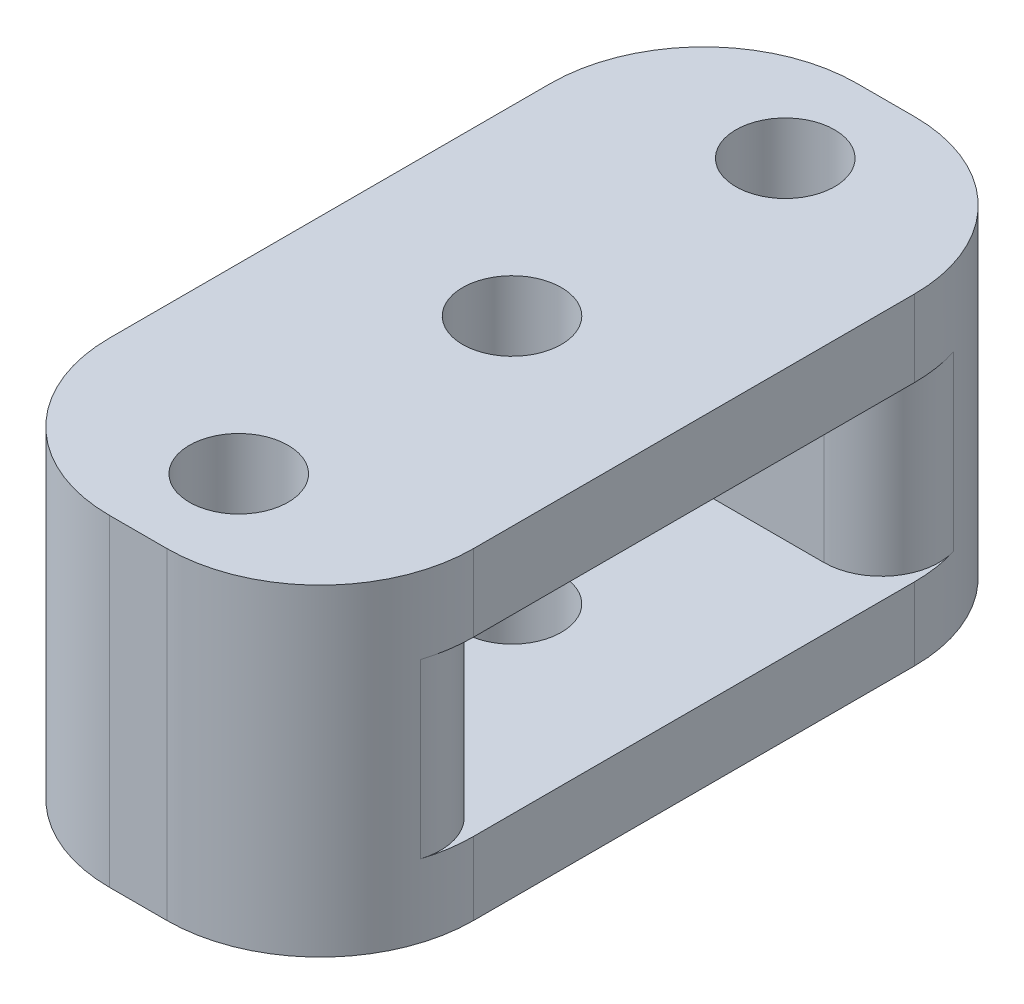
ISO-10303-21;
HEADER;
FILE_DESCRIPTION(('STEP AP214'),'2;1');
FILE_NAME('part.step','',(''),(''),'','','');
FILE_SCHEMA(('AUTOMOTIVE_DESIGN { 1 0 10303 214 1 1 1 1 }'));
ENDSEC;
DATA;
#1=APPLICATION_CONTEXT('core data for automotive mechanical design processes');
#2=APPLICATION_PROTOCOL_DEFINITION('international standard','automotive_design',2000,#1);
#3=PRODUCT_CONTEXT('',#1,'mechanical');
#4=PRODUCT('Part','Part','',(#3));
#5=PRODUCT_RELATED_PRODUCT_CATEGORY('part','',(#4));
#6=PRODUCT_DEFINITION_FORMATION('','',#4);
#7=PRODUCT_DEFINITION_CONTEXT('part definition',#1,'design');
#8=PRODUCT_DEFINITION('design','',#6,#7);
#9=PRODUCT_DEFINITION_SHAPE('','',#8);
#10=(LENGTH_UNIT() NAMED_UNIT(*) SI_UNIT(.MILLI.,.METRE.));
#11=(NAMED_UNIT(*) PLANE_ANGLE_UNIT() SI_UNIT($,.RADIAN.));
#12=(NAMED_UNIT(*) SI_UNIT($,.STERADIAN.) SOLID_ANGLE_UNIT());
#13=UNCERTAINTY_MEASURE_WITH_UNIT(LENGTH_MEASURE(1.E-05),#10,'distance_accuracy_value','');
#14=(GEOMETRIC_REPRESENTATION_CONTEXT(3) GLOBAL_UNCERTAINTY_ASSIGNED_CONTEXT((#13)) GLOBAL_UNIT_ASSIGNED_CONTEXT((#10,
#11,#12)) REPRESENTATION_CONTEXT('',''));
#15=CARTESIAN_POINT('',(0.,0.,0.));
#16=DIRECTION('',(0.,0.,1.));
#17=DIRECTION('',(1.,0.,0.));
#18=AXIS2_PLACEMENT_3D('',#15,#16,#17);
#19=CARTESIAN_POINT('',(-9.50000000000001,3.8,-19.5));
#20=DIRECTION('',(1.,0.,0.));
#21=DIRECTION('',(0.,0.,-1.));
#22=AXIS2_PLACEMENT_3D('',#19,#20,#21);
#23=PLANE('',#22);
#24=DIRECTION('',(0.,0.,1.));
#25=VECTOR('',#24,1.);
#26=CARTESIAN_POINT('',(-9.50000000000001,3.8,-19.5));
#27=LINE('',#26,#25);
#28=CARTESIAN_POINT('',(-9.50000000000001,3.8,-11.5));
#29=VERTEX_POINT('',#28);
#30=CARTESIAN_POINT('',(-9.5,3.8,11.5));
#31=VERTEX_POINT('',#30);
#32=EDGE_CURVE('E229',#29,#31,#27,.T.);
#33=ORIENTED_EDGE('',*,*,#32,.F.);
#34=DIRECTION('',(0.,-1.,0.));
#35=VECTOR('',#34,1.);
#36=CARTESIAN_POINT('',(-9.50000000000001,3.8,-11.5));
#37=LINE('',#36,#35);
#38=CARTESIAN_POINT('',(-9.50000000000001,0.,-11.5));
#39=VERTEX_POINT('',#38);
#40=EDGE_CURVE('E193',#29,#39,#37,.T.);
#41=ORIENTED_EDGE('',*,*,#40,.T.);
#42=DIRECTION('',(0.,0.,1.));
#43=VECTOR('',#42,1.);
#44=CARTESIAN_POINT('',(-9.50000000000001,0.,-19.5));
#45=LINE('',#44,#43);
#46=CARTESIAN_POINT('',(-9.5,0.,11.5));
#47=VERTEX_POINT('',#46);
#48=EDGE_CURVE('E218',#39,#47,#45,.T.);
#49=ORIENTED_EDGE('',*,*,#48,.T.);
#50=DIRECTION('',(0.,-1.,0.));
#51=VECTOR('',#50,1.);
#52=CARTESIAN_POINT('',(-9.5,3.8,11.5));
#53=LINE('',#52,#51);
#54=EDGE_CURVE('E186',#47,#31,#53,.F.);
#55=ORIENTED_EDGE('',*,*,#54,.T.);
#56=EDGE_LOOP('',(#33,#41,#49,#55));
#57=FACE_BOUND('',#56,.T.);
#58=ADVANCED_FACE('F42',(#57),#23,.F.);
#59=CARTESIAN_POINT('',(9.5,3.8,-19.5));
#60=DIRECTION('',(-1.,0.,0.));
#61=DIRECTION('',(0.,0.,1.));
#62=AXIS2_PLACEMENT_3D('',#59,#60,#61);
#63=PLANE('',#62);
#64=DIRECTION('',(0.,-1.,0.));
#65=VECTOR('',#64,1.);
#66=CARTESIAN_POINT('',(9.5,3.8,-11.5));
#67=LINE('',#66,#65);
#68=CARTESIAN_POINT('',(9.5,0.,-11.5));
#69=VERTEX_POINT('',#68);
#70=CARTESIAN_POINT('',(9.5,3.8,-11.5));
#71=VERTEX_POINT('',#70);
#72=EDGE_CURVE('E272',#69,#71,#67,.F.);
#73=ORIENTED_EDGE('',*,*,#72,.T.);
#74=DIRECTION('',(0.,0.,-1.));
#75=VECTOR('',#74,1.);
#76=CARTESIAN_POINT('',(9.5,3.8,-19.5));
#77=LINE('',#76,#75);
#78=CARTESIAN_POINT('',(9.5,3.8,11.5));
#79=VERTEX_POINT('',#78);
#80=EDGE_CURVE('E58',#79,#71,#77,.T.);
#81=ORIENTED_EDGE('',*,*,#80,.F.);
#82=DIRECTION('',(0.,-1.,0.));
#83=VECTOR('',#82,1.);
#84=CARTESIAN_POINT('',(9.5,3.8,11.5));
#85=LINE('',#84,#83);
#86=CARTESIAN_POINT('',(9.5,0.,11.5));
#87=VERTEX_POINT('',#86);
#88=EDGE_CURVE('E262',#79,#87,#85,.T.);
#89=ORIENTED_EDGE('',*,*,#88,.T.);
#90=DIRECTION('',(0.,0.,-1.));
#91=VECTOR('',#90,1.);
#92=CARTESIAN_POINT('',(9.5,0.,-19.5));
#93=LINE('',#92,#91);
#94=EDGE_CURVE('E213',#87,#69,#93,.T.);
#95=ORIENTED_EDGE('',*,*,#94,.T.);
#96=EDGE_LOOP('',(#73,#81,#89,#95));
#97=FACE_BOUND('',#96,.T.);
#98=ADVANCED_FACE('F408',(#97),#63,.F.);
#99=CARTESIAN_POINT('',(0.,3.8,0.));
#100=DIRECTION('',(0.,-1.,0.));
#101=DIRECTION('',(0.,0.,-1.));
#102=AXIS2_PLACEMENT_3D('',#99,#100,#101);
#103=PLANE('',#102);
#104=CARTESIAN_POINT('',(0.,3.8,0.));
#105=DIRECTION('',(0.,1.,0.));
#106=DIRECTION('',(0.,0.,1.));
#107=AXIS2_PLACEMENT_3D('',#104,#105,#106);
#108=CIRCLE('',#107,2.575);
#109=CARTESIAN_POINT('',(0.,3.8,-2.575));
#110=VERTEX_POINT('',#109);
#111=EDGE_CURVE('E225',#110,#110,#108,.T.);
#112=ORIENTED_EDGE('',*,*,#111,.F.);
#113=EDGE_LOOP('',(#112));
#114=FACE_BOUND('',#113,.T.);
#115=DIRECTION('',(-1.,0.,0.));
#116=VECTOR('',#115,1.);
#117=CARTESIAN_POINT('',(9.5,3.8,10.));
#118=LINE('',#117,#116);
#119=CARTESIAN_POINT('',(6.26969600708472,3.8,10.));
#120=VERTEX_POINT('',#119);
#121=CARTESIAN_POINT('',(-6.26969600708472,3.8,10.));
#122=VERTEX_POINT('',#121);
#123=EDGE_CURVE('E357',#120,#122,#118,.T.);
#124=ORIENTED_EDGE('',*,*,#123,.F.);
#125=CARTESIAN_POINT('',(6.26969600708472,3.8,13.));
#126=DIRECTION('',(0.,-1.,0.));
#127=DIRECTION('',(0.,0.,-1.));
#128=AXIS2_PLACEMENT_3D('',#125,#126,#127);
#129=CIRCLE('',#128,3.);
#130=CARTESIAN_POINT('',(9.13151361133556,3.8,13.9));
#131=VERTEX_POINT('',#130);
#132=EDGE_CURVE('E52',#120,#131,#129,.T.);
#133=ORIENTED_EDGE('',*,*,#132,.T.);
#134=CARTESIAN_POINT('',(1.5,3.8,11.5));
#135=DIRECTION('',(0.,-1.,0.));
#136=DIRECTION('',(0.,0.,-1.));
#137=AXIS2_PLACEMENT_3D('',#134,#135,#136);
#138=CIRCLE('',#137,8.);
#139=EDGE_CURVE('E327',#79,#131,#138,.T.);
#140=ORIENTED_EDGE('',*,*,#139,.F.);
#141=ORIENTED_EDGE('',*,*,#80,.T.);
#142=CARTESIAN_POINT('',(1.5,3.8,-11.5));
#143=DIRECTION('',(0.,-1.,0.));
#144=DIRECTION('',(0.,0.,-1.));
#145=AXIS2_PLACEMENT_3D('',#142,#143,#144);
#146=CIRCLE('',#145,8.);
#147=CARTESIAN_POINT('',(9.13151361133558,3.8,-13.9));
#148=VERTEX_POINT('',#147);
#149=EDGE_CURVE('E285',#148,#71,#146,.T.);
#150=ORIENTED_EDGE('',*,*,#149,.F.);
#151=CARTESIAN_POINT('',(6.26969600708474,3.8,-13.));
#152=DIRECTION('',(0.,-1.,0.));
#153=DIRECTION('',(0.,0.,-1.));
#154=AXIS2_PLACEMENT_3D('',#151,#152,#153);
#155=CIRCLE('',#154,3.);
#156=CARTESIAN_POINT('',(6.26969600708474,3.8,-10.));
#157=VERTEX_POINT('',#156);
#158=EDGE_CURVE('E333',#148,#157,#155,.T.);
#159=ORIENTED_EDGE('',*,*,#158,.T.);
#160=DIRECTION('',(1.,0.,0.));
#161=VECTOR('',#160,1.);
#162=CARTESIAN_POINT('',(9.5,3.8,-10.));
#163=LINE('',#162,#161);
#164=CARTESIAN_POINT('',(-6.26969600708474,3.8,-10.));
#165=VERTEX_POINT('',#164);
#166=EDGE_CURVE('E382',#165,#157,#163,.T.);
#167=ORIENTED_EDGE('',*,*,#166,.F.);
#168=CARTESIAN_POINT('',(-6.26969600708474,3.8,-13.));
#169=DIRECTION('',(0.,-1.,0.));
#170=DIRECTION('',(0.,0.,-1.));
#171=AXIS2_PLACEMENT_3D('',#168,#169,#170);
#172=CIRCLE('',#171,3.);
#173=CARTESIAN_POINT('',(-9.13151361133558,3.8,-13.9));
#174=VERTEX_POINT('',#173);
#175=EDGE_CURVE('E338',#165,#174,#172,.T.);
#176=ORIENTED_EDGE('',*,*,#175,.T.);
#177=CARTESIAN_POINT('',(-1.50000000000001,3.8,-11.5));
#178=DIRECTION('',(0.,-1.,0.));
#179=DIRECTION('',(0.,0.,-1.));
#180=AXIS2_PLACEMENT_3D('',#177,#178,#179);
#181=CIRCLE('',#180,8.);
#182=EDGE_CURVE('E301',#29,#174,#181,.T.);
#183=ORIENTED_EDGE('',*,*,#182,.F.);
#184=ORIENTED_EDGE('',*,*,#32,.T.);
#185=CARTESIAN_POINT('',(-1.5,3.8,11.5));
#186=DIRECTION('',(0.,-1.,0.));
#187=DIRECTION('',(0.,0.,-1.));
#188=AXIS2_PLACEMENT_3D('',#185,#186,#187);
#189=CIRCLE('',#188,8.);
#190=CARTESIAN_POINT('',(-9.13151361133556,3.8,13.9));
#191=VERTEX_POINT('',#190);
#192=EDGE_CURVE('E315',#191,#31,#189,.T.);
#193=ORIENTED_EDGE('',*,*,#192,.F.);
#194=CARTESIAN_POINT('',(-6.26969600708472,3.8,13.));
#195=DIRECTION('',(0.,-1.,0.));
#196=DIRECTION('',(0.,0.,-1.));
#197=AXIS2_PLACEMENT_3D('',#194,#195,#196);
#198=CIRCLE('',#197,3.);
#199=EDGE_CURVE('E348',#191,#122,#198,.T.);
#200=ORIENTED_EDGE('',*,*,#199,.T.);
#201=EDGE_LOOP('',(#124,#133,#140,#141,#150,#159,#167,#176,#183,#184,#193,#200));
#202=FACE_BOUND('',#201,.T.);
#203=ADVANCED_FACE('F353',(#114,#202),#103,.F.);
#204=CARTESIAN_POINT('',(0.,0.,0.));
#205=DIRECTION('',(0.,-1.,0.));
#206=DIRECTION('',(0.,0.,-1.));
#207=AXIS2_PLACEMENT_3D('',#204,#205,#206);
#208=PLANE('',#207);
#209=CARTESIAN_POINT('',(0.,0.,14.25));
#210=DIRECTION('',(0.,1.,0.));
#211=DIRECTION('',(0.,0.,1.));
#212=AXIS2_PLACEMENT_3D('',#209,#210,#211);
#213=CIRCLE('',#212,2.575);
#214=CARTESIAN_POINT('',(0.,0.,11.675));
#215=VERTEX_POINT('',#214);
#216=EDGE_CURVE('E378',#215,#215,#213,.T.);
#217=ORIENTED_EDGE('',*,*,#216,.T.);
#218=EDGE_LOOP('',(#217));
#219=FACE_BOUND('',#218,.T.);
#220=DIRECTION('',(1.,0.,0.));
#221=VECTOR('',#220,1.);
#222=CARTESIAN_POINT('',(9.5,0.,19.5));
#223=LINE('',#222,#221);
#224=CARTESIAN_POINT('',(-1.5,0.,19.5));
#225=VERTEX_POINT('',#224);
#226=CARTESIAN_POINT('',(1.5,0.,19.5));
#227=VERTEX_POINT('',#226);
#228=EDGE_CURVE('E201',#225,#227,#223,.T.);
#229=ORIENTED_EDGE('',*,*,#228,.F.);
#230=CARTESIAN_POINT('',(-1.5,0.,11.5));
#231=DIRECTION('',(0.,-1.,0.));
#232=DIRECTION('',(0.,0.,-1.));
#233=AXIS2_PLACEMENT_3D('',#230,#231,#232);
#234=CIRCLE('',#233,8.);
#235=EDGE_CURVE('E181',#225,#47,#234,.T.);
#236=ORIENTED_EDGE('',*,*,#235,.T.);
#237=ORIENTED_EDGE('',*,*,#48,.F.);
#238=CARTESIAN_POINT('',(-1.50000000000001,0.,-11.5));
#239=DIRECTION('',(0.,-1.,0.));
#240=DIRECTION('',(0.,0.,-1.));
#241=AXIS2_PLACEMENT_3D('',#238,#239,#240);
#242=CIRCLE('',#241,8.);
#243=CARTESIAN_POINT('',(-1.50000000000001,0.,-19.5));
#244=VERTEX_POINT('',#243);
#245=EDGE_CURVE('E198',#39,#244,#242,.T.);
#246=ORIENTED_EDGE('',*,*,#245,.T.);
#247=DIRECTION('',(-1.,0.,0.));
#248=VECTOR('',#247,1.);
#249=CARTESIAN_POINT('',(9.5,0.,-19.5));
#250=LINE('',#249,#248);
#251=CARTESIAN_POINT('',(1.5,0.,-19.5));
#252=VERTEX_POINT('',#251);
#253=EDGE_CURVE('E224',#252,#244,#250,.T.);
#254=ORIENTED_EDGE('',*,*,#253,.F.);
#255=CARTESIAN_POINT('',(1.5,0.,-11.5));
#256=DIRECTION('',(0.,-1.,0.));
#257=DIRECTION('',(0.,0.,-1.));
#258=AXIS2_PLACEMENT_3D('',#255,#256,#257);
#259=CIRCLE('',#258,8.);
#260=EDGE_CURVE('E232',#252,#69,#259,.T.);
#261=ORIENTED_EDGE('',*,*,#260,.T.);
#262=ORIENTED_EDGE('',*,*,#94,.F.);
#263=CARTESIAN_POINT('',(1.5,0.,11.5));
#264=DIRECTION('',(0.,-1.,0.));
#265=DIRECTION('',(0.,0.,-1.));
#266=AXIS2_PLACEMENT_3D('',#263,#264,#265);
#267=CIRCLE('',#266,8.);
#268=EDGE_CURVE('E210',#87,#227,#267,.T.);
#269=ORIENTED_EDGE('',*,*,#268,.T.);
#270=EDGE_LOOP('',(#229,#236,#237,#246,#254,#261,#262,#269));
#271=FACE_BOUND('',#270,.T.);
#272=CARTESIAN_POINT('',(0.,0.,0.));
#273=DIRECTION('',(0.,1.,0.));
#274=DIRECTION('',(0.,0.,1.));
#275=AXIS2_PLACEMENT_3D('',#272,#273,#274);
#276=CIRCLE('',#275,2.575);
#277=CARTESIAN_POINT('',(0.,0.,-2.575));
#278=VERTEX_POINT('',#277);
#279=EDGE_CURVE('E399',#278,#278,#276,.T.);
#280=ORIENTED_EDGE('',*,*,#279,.T.);
#281=EDGE_LOOP('',(#280));
#282=FACE_BOUND('',#281,.T.);
#283=CARTESIAN_POINT('',(0.,0.,-14.25));
#284=DIRECTION('',(0.,1.,0.));
#285=DIRECTION('',(0.,0.,1.));
#286=AXIS2_PLACEMENT_3D('',#283,#284,#285);
#287=CIRCLE('',#286,2.575);
#288=CARTESIAN_POINT('',(0.,0.,-16.825));
#289=VERTEX_POINT('',#288);
#290=EDGE_CURVE('E372',#289,#289,#287,.T.);
#291=ORIENTED_EDGE('',*,*,#290,.T.);
#292=EDGE_LOOP('',(#291));
#293=FACE_BOUND('',#292,.T.);
#294=ADVANCED_FACE('F208',(#219,#271,#282,#293),#208,.T.);
#295=CARTESIAN_POINT('',(-9.50000000000001,16.8,-11.5));
#296=VERTEX_POINT('',#295);
#297=CARTESIAN_POINT('',(-9.50000000000001,12.8,-11.5));
#298=VERTEX_POINT('',#297);
#299=EDGE_CURVE('E239',#296,#298,#37,.T.);
#300=ORIENTED_EDGE('',*,*,#299,.T.);
#301=DIRECTION('',(0.,0.,1.));
#302=VECTOR('',#301,1.);
#303=CARTESIAN_POINT('',(-9.5,12.8,19.5));
#304=LINE('',#303,#302);
#305=CARTESIAN_POINT('',(-9.5,12.8,11.5));
#306=VERTEX_POINT('',#305);
#307=EDGE_CURVE('E66',#298,#306,#304,.T.);
#308=ORIENTED_EDGE('',*,*,#307,.T.);
#309=CARTESIAN_POINT('',(-9.5,16.8,11.5));
#310=VERTEX_POINT('',#309);
#311=EDGE_CURVE('E243',#306,#310,#53,.F.);
#312=ORIENTED_EDGE('',*,*,#311,.T.);
#313=DIRECTION('',(0.,0.,1.));
#314=VECTOR('',#313,1.);
#315=CARTESIAN_POINT('',(-9.5,16.8,19.5));
#316=LINE('',#315,#314);
#317=EDGE_CURVE('E421',#296,#310,#316,.T.);
#318=ORIENTED_EDGE('',*,*,#317,.F.);
#319=EDGE_LOOP('',(#300,#308,#312,#318));
#320=FACE_BOUND('',#319,.T.);
#321=ADVANCED_FACE('F479',(#320),#23,.F.);
#322=CARTESIAN_POINT('',(9.5,3.8,19.5));
#323=DIRECTION('',(0.,0.,-1.));
#324=DIRECTION('',(-1.,0.,0.));
#325=AXIS2_PLACEMENT_3D('',#322,#323,#324);
#326=PLANE('',#325);
#327=DIRECTION('',(1.,0.,0.));
#328=VECTOR('',#327,1.);
#329=CARTESIAN_POINT('',(9.5,16.8,19.5));
#330=LINE('',#329,#328);
#331=CARTESIAN_POINT('',(-1.5,16.8,19.5));
#332=VERTEX_POINT('',#331);
#333=CARTESIAN_POINT('',(1.5,16.8,19.5));
#334=VERTEX_POINT('',#333);
#335=EDGE_CURVE('E202',#332,#334,#330,.T.);
#336=ORIENTED_EDGE('',*,*,#335,.F.);
#337=DIRECTION('',(0.,-1.,0.));
#338=VECTOR('',#337,1.);
#339=CARTESIAN_POINT('',(-1.5,3.8,19.5));
#340=LINE('',#339,#338);
#341=EDGE_CURVE('E187',#332,#225,#340,.T.);
#342=ORIENTED_EDGE('',*,*,#341,.T.);
#343=ORIENTED_EDGE('',*,*,#228,.T.);
#344=DIRECTION('',(0.,-1.,0.));
#345=VECTOR('',#344,1.);
#346=CARTESIAN_POINT('',(1.5,3.8,19.5));
#347=LINE('',#346,#345);
#348=EDGE_CURVE('E206',#227,#334,#347,.F.);
#349=ORIENTED_EDGE('',*,*,#348,.T.);
#350=EDGE_LOOP('',(#336,#342,#343,#349));
#351=FACE_BOUND('',#350,.T.);
#352=ADVANCED_FACE('F204',(#351),#326,.F.);
#353=DIRECTION('',(0.,0.,-1.));
#354=VECTOR('',#353,1.);
#355=CARTESIAN_POINT('',(9.5,12.8,19.5));
#356=LINE('',#355,#354);
#357=CARTESIAN_POINT('',(9.5,12.8,11.5));
#358=VERTEX_POINT('',#357);
#359=CARTESIAN_POINT('',(9.5,12.8,-11.5));
#360=VERTEX_POINT('',#359);
#361=EDGE_CURVE('E434',#358,#360,#356,.T.);
#362=ORIENTED_EDGE('',*,*,#361,.T.);
#363=CARTESIAN_POINT('',(9.5,16.8,-11.5));
#364=VERTEX_POINT('',#363);
#365=EDGE_CURVE('E267',#360,#364,#67,.F.);
#366=ORIENTED_EDGE('',*,*,#365,.T.);
#367=DIRECTION('',(0.,0.,-1.));
#368=VECTOR('',#367,1.);
#369=CARTESIAN_POINT('',(9.5,16.8,19.5));
#370=LINE('',#369,#368);
#371=CARTESIAN_POINT('',(9.5,16.8,11.5));
#372=VERTEX_POINT('',#371);
#373=EDGE_CURVE('E425',#372,#364,#370,.T.);
#374=ORIENTED_EDGE('',*,*,#373,.F.);
#375=EDGE_CURVE('E269',#372,#358,#85,.T.);
#376=ORIENTED_EDGE('',*,*,#375,.T.);
#377=EDGE_LOOP('',(#362,#366,#374,#376));
#378=FACE_BOUND('',#377,.T.);
#379=ADVANCED_FACE('F483',(#378),#63,.F.);
#380=CARTESIAN_POINT('',(9.5,3.8,-19.5));
#381=DIRECTION('',(0.,0.,1.));
#382=DIRECTION('',(1.,0.,0.));
#383=AXIS2_PLACEMENT_3D('',#380,#381,#382);
#384=PLANE('',#383);
#385=ORIENTED_EDGE('',*,*,#253,.T.);
#386=DIRECTION('',(0.,-1.,0.));
#387=VECTOR('',#386,1.);
#388=CARTESIAN_POINT('',(-1.50000000000001,3.8,-19.5));
#389=LINE('',#388,#387);
#390=CARTESIAN_POINT('',(-1.50000000000001,16.8,-19.5));
#391=VERTEX_POINT('',#390);
#392=EDGE_CURVE('E265',#244,#391,#389,.F.);
#393=ORIENTED_EDGE('',*,*,#392,.T.);
#394=DIRECTION('',(-1.,0.,0.));
#395=VECTOR('',#394,1.);
#396=CARTESIAN_POINT('',(9.49999999999999,16.8,-19.5));
#397=LINE('',#396,#395);
#398=CARTESIAN_POINT('',(1.5,16.8,-19.5));
#399=VERTEX_POINT('',#398);
#400=EDGE_CURVE('E418',#399,#391,#397,.T.);
#401=ORIENTED_EDGE('',*,*,#400,.F.);
#402=DIRECTION('',(0.,-1.,0.));
#403=VECTOR('',#402,1.);
#404=CARTESIAN_POINT('',(1.5,3.8,-19.5));
#405=LINE('',#404,#403);
#406=EDGE_CURVE('E259',#399,#252,#405,.T.);
#407=ORIENTED_EDGE('',*,*,#406,.T.);
#408=EDGE_LOOP('',(#385,#393,#401,#407));
#409=FACE_BOUND('',#408,.T.);
#410=ADVANCED_FACE('F419',(#409),#384,.F.);
#411=CARTESIAN_POINT('',(0.,3.8,0.));
#412=DIRECTION('',(0.,-1.,0.));
#413=DIRECTION('',(0.,0.,-1.));
#414=AXIS2_PLACEMENT_3D('',#411,#412,#413);
#415=CYLINDRICAL_SURFACE('',#414,2.575);
#416=CARTESIAN_POINT('',(0.,3.8,-2.575));
#417=CARTESIAN_POINT('',(0.,3.76041666666667,-2.575));
#418=CARTESIAN_POINT('',(0.,3.72083333333333,-2.575));
#419=CARTESIAN_POINT('',(0.,3.64166666666667,-2.575));
#420=CARTESIAN_POINT('',(0.,3.60208333333333,-2.575));
#421=CARTESIAN_POINT('',(0.,3.52291666666667,-2.575));
#422=CARTESIAN_POINT('',(0.,3.48333333333333,-2.575));
#423=CARTESIAN_POINT('',(0.,3.40416666666667,-2.575));
#424=CARTESIAN_POINT('',(0.,3.36458333333333,-2.575));
#425=CARTESIAN_POINT('',(0.,3.28541666666667,-2.575));
#426=CARTESIAN_POINT('',(0.,3.24583333333333,-2.575));
#427=CARTESIAN_POINT('',(0.,3.16666666666667,-2.575));
#428=CARTESIAN_POINT('',(0.,3.12708333333333,-2.575));
#429=CARTESIAN_POINT('',(0.,3.04791666666667,-2.575));
#430=CARTESIAN_POINT('',(0.,3.00833333333333,-2.575));
#431=CARTESIAN_POINT('',(0.,2.92916666666667,-2.575));
#432=CARTESIAN_POINT('',(0.,2.88958333333333,-2.575));
#433=CARTESIAN_POINT('',(0.,2.81041666666667,-2.575));
#434=CARTESIAN_POINT('',(0.,2.77083333333333,-2.575));
#435=CARTESIAN_POINT('',(0.,2.69166666666667,-2.575));
#436=CARTESIAN_POINT('',(0.,2.65208333333333,-2.575));
#437=CARTESIAN_POINT('',(0.,2.57291666666667,-2.575));
#438=CARTESIAN_POINT('',(0.,2.53333333333333,-2.575));
#439=CARTESIAN_POINT('',(0.,2.45416666666667,-2.575));
#440=CARTESIAN_POINT('',(0.,2.41458333333333,-2.575));
#441=CARTESIAN_POINT('',(0.,2.33541666666667,-2.575));
#442=CARTESIAN_POINT('',(0.,2.29583333333333,-2.575));
#443=CARTESIAN_POINT('',(0.,2.21666666666667,-2.575));
#444=CARTESIAN_POINT('',(0.,2.17708333333333,-2.575));
#445=CARTESIAN_POINT('',(0.,2.09791666666667,-2.575));
#446=CARTESIAN_POINT('',(0.,2.05833333333333,-2.575));
#447=CARTESIAN_POINT('',(0.,1.97916666666667,-2.575));
#448=CARTESIAN_POINT('',(0.,1.93958333333333,-2.575));
#449=CARTESIAN_POINT('',(0.,1.86041666666667,-2.575));
#450=CARTESIAN_POINT('',(0.,1.82083333333333,-2.575));
#451=CARTESIAN_POINT('',(0.,1.74166666666667,-2.575));
#452=CARTESIAN_POINT('',(0.,1.70208333333333,-2.575));
#453=CARTESIAN_POINT('',(0.,1.62291666666667,-2.575));
#454=CARTESIAN_POINT('',(0.,1.58333333333333,-2.575));
#455=CARTESIAN_POINT('',(0.,1.50416666666667,-2.575));
#456=CARTESIAN_POINT('',(0.,1.46458333333333,-2.575));
#457=CARTESIAN_POINT('',(0.,1.38541666666667,-2.575));
#458=CARTESIAN_POINT('',(0.,1.34583333333333,-2.575));
#459=CARTESIAN_POINT('',(0.,1.26666666666667,-2.575));
#460=CARTESIAN_POINT('',(0.,1.22708333333333,-2.575));
#461=CARTESIAN_POINT('',(0.,1.14791666666667,-2.575));
#462=CARTESIAN_POINT('',(0.,1.10833333333333,-2.575));
#463=CARTESIAN_POINT('',(0.,1.02916666666667,-2.575));
#464=CARTESIAN_POINT('',(0.,0.989583333333333,-2.575));
#465=CARTESIAN_POINT('',(0.,0.910416666666667,-2.575));
#466=CARTESIAN_POINT('',(0.,0.870833333333333,-2.575));
#467=CARTESIAN_POINT('',(0.,0.791666666666667,-2.575));
#468=CARTESIAN_POINT('',(0.,0.752083333333333,-2.575));
#469=CARTESIAN_POINT('',(0.,0.672916666666667,-2.575));
#470=CARTESIAN_POINT('',(0.,0.633333333333333,-2.575));
#471=CARTESIAN_POINT('',(0.,0.554166666666667,-2.575));
#472=CARTESIAN_POINT('',(0.,0.514583333333334,-2.575));
#473=CARTESIAN_POINT('',(0.,0.435416666666667,-2.575));
#474=CARTESIAN_POINT('',(0.,0.395833333333333,-2.575));
#475=CARTESIAN_POINT('',(0.,0.316666666666666,-2.575));
#476=CARTESIAN_POINT('',(0.,0.277083333333333,-2.575));
#477=CARTESIAN_POINT('',(0.,0.197916666666667,-2.575));
#478=CARTESIAN_POINT('',(0.,0.158333333333333,-2.575));
#479=CARTESIAN_POINT('',(0.,0.0791666666666666,-2.575));
#480=CARTESIAN_POINT('',(0.,0.0395833333333333,-2.575));
#481=CARTESIAN_POINT('',(0.,0.,-2.575));
#482=B_SPLINE_CURVE_WITH_KNOTS('',3,(#416,#417,#418,#419,#420,#421,#422,#423,#424,#425,#426,
#427,#428,#429,#430,#431,#432,#433,#434,#435,#436,#437,#438,#439,#440,#441,#442,#443,#444,#445,
#446,#447,#448,#449,#450,#451,#452,#453,#454,#455,#456,#457,#458,#459,#460,#461,#462,#463,#464,
#465,#466,#467,#468,#469,#470,#471,#472,#473,#474,#475,#476,#477,#478,#479,#480,#481),
.UNSPECIFIED.,.F.,.F.,(4,2,2,2,2,2,2,2,2,2,2,2,2,2,2,2,2,2,2,2,2,2,2,2,2,2,2,2,2,2,2,2,4),(0.,
0.11875,0.2375,0.35625,0.475,0.59375,0.7125,0.831249999999999,0.95,1.06875,1.1875,1.30625,1.425,
1.54375,1.6625,1.78125,1.9,2.01875,2.1375,2.25625,2.375,2.49375,2.6125,2.73125,2.85,2.96875,
3.0875,3.20625,3.325,3.44375,3.5625,3.68125,3.8),.UNSPECIFIED.);
#483=EDGE_CURVE('BSEAM527',#110,#278,#482,.T.);
#484=ORIENTED_EDGE('',*,*,#111,.T.);
#485=ORIENTED_EDGE('',*,*,#279,.F.);
#486=ORIENTED_EDGE('',*,*,#483,.T.);
#487=ORIENTED_EDGE('',*,*,#483,.F.);
#488=EDGE_LOOP('',(#484,#486,#485,#487));
#489=FACE_BOUND('',#488,.T.);
#490=ADVANCED_FACE('F527',(#489),#415,.F.);
#491=CARTESIAN_POINT('',(0.,3.8,14.25));
#492=DIRECTION('',(0.,-1.,0.));
#493=DIRECTION('',(0.,0.,-1.));
#494=AXIS2_PLACEMENT_3D('',#491,#492,#493);
#495=CYLINDRICAL_SURFACE('',#494,2.575);
#496=CARTESIAN_POINT('',(0.,16.8,14.25));
#497=DIRECTION('',(0.,1.,0.));
#498=DIRECTION('',(0.,0.,1.));
#499=AXIS2_PLACEMENT_3D('',#496,#497,#498);
#500=CIRCLE('',#499,2.575);
#501=CARTESIAN_POINT('',(0.,16.8,11.675));
#502=VERTEX_POINT('',#501);
#503=EDGE_CURVE('E440',#502,#502,#500,.T.);
#504=CARTESIAN_POINT('',(0.,0.,11.675));
#505=CARTESIAN_POINT('',(0.,0.175,11.675));
#506=CARTESIAN_POINT('',(0.,0.35,11.675));
#507=CARTESIAN_POINT('',(0.,0.7,11.675));
#508=CARTESIAN_POINT('',(0.,0.875,11.675));
#509=CARTESIAN_POINT('',(0.,1.225,11.675));
#510=CARTESIAN_POINT('',(0.,1.4,11.675));
#511=CARTESIAN_POINT('',(0.,1.75,11.675));
#512=CARTESIAN_POINT('',(0.,1.925,11.675));
#513=CARTESIAN_POINT('',(0.,2.275,11.675));
#514=CARTESIAN_POINT('',(0.,2.45,11.675));
#515=CARTESIAN_POINT('',(0.,2.8,11.675));
#516=CARTESIAN_POINT('',(0.,2.975,11.675));
#517=CARTESIAN_POINT('',(0.,3.325,11.675));
#518=CARTESIAN_POINT('',(0.,3.5,11.675));
#519=CARTESIAN_POINT('',(0.,3.85,11.675));
#520=CARTESIAN_POINT('',(0.,4.025,11.675));
#521=CARTESIAN_POINT('',(0.,4.375,11.675));
#522=CARTESIAN_POINT('',(0.,4.55,11.675));
#523=CARTESIAN_POINT('',(0.,4.9,11.675));
#524=CARTESIAN_POINT('',(0.,5.075,11.675));
#525=CARTESIAN_POINT('',(0.,5.425,11.675));
#526=CARTESIAN_POINT('',(0.,5.6,11.675));
#527=CARTESIAN_POINT('',(0.,5.95,11.675));
#528=CARTESIAN_POINT('',(0.,6.125,11.675));
#529=CARTESIAN_POINT('',(0.,6.475,11.675));
#530=CARTESIAN_POINT('',(0.,6.65,11.675));
#531=CARTESIAN_POINT('',(0.,7.,11.675));
#532=CARTESIAN_POINT('',(0.,7.175,11.675));
#533=CARTESIAN_POINT('',(0.,7.525,11.675));
#534=CARTESIAN_POINT('',(0.,7.7,11.675));
#535=CARTESIAN_POINT('',(0.,8.05,11.675));
#536=CARTESIAN_POINT('',(0.,8.225,11.675));
#537=CARTESIAN_POINT('',(0.,8.575,11.675));
#538=CARTESIAN_POINT('',(0.,8.75,11.675));
#539=CARTESIAN_POINT('',(0.,9.1,11.675));
#540=CARTESIAN_POINT('',(0.,9.275,11.675));
#541=CARTESIAN_POINT('',(0.,9.625,11.675));
#542=CARTESIAN_POINT('',(0.,9.8,11.675));
#543=CARTESIAN_POINT('',(0.,10.15,11.675));
#544=CARTESIAN_POINT('',(0.,10.325,11.675));
#545=CARTESIAN_POINT('',(0.,10.675,11.675));
#546=CARTESIAN_POINT('',(0.,10.85,11.675));
#547=CARTESIAN_POINT('',(0.,11.2,11.675));
#548=CARTESIAN_POINT('',(0.,11.375,11.675));
#549=CARTESIAN_POINT('',(0.,11.725,11.675));
#550=CARTESIAN_POINT('',(0.,11.9,11.675));
#551=CARTESIAN_POINT('',(0.,12.25,11.675));
#552=CARTESIAN_POINT('',(0.,12.425,11.675));
#553=CARTESIAN_POINT('',(0.,12.775,11.675));
#554=CARTESIAN_POINT('',(0.,12.95,11.675));
#555=CARTESIAN_POINT('',(0.,13.3,11.675));
#556=CARTESIAN_POINT('',(0.,13.475,11.675));
#557=CARTESIAN_POINT('',(0.,13.825,11.675));
#558=CARTESIAN_POINT('',(0.,14.,11.675));
#559=CARTESIAN_POINT('',(0.,14.35,11.675));
#560=CARTESIAN_POINT('',(0.,14.525,11.675));
#561=CARTESIAN_POINT('',(0.,14.875,11.675));
#562=CARTESIAN_POINT('',(0.,15.05,11.675));
#563=CARTESIAN_POINT('',(0.,15.4,11.675));
#564=CARTESIAN_POINT('',(0.,15.575,11.675));
#565=CARTESIAN_POINT('',(0.,15.925,11.675));
#566=CARTESIAN_POINT('',(0.,16.1,11.675));
#567=CARTESIAN_POINT('',(0.,16.45,11.675));
#568=CARTESIAN_POINT('',(0.,16.625,11.675));
#569=CARTESIAN_POINT('',(0.,16.8,11.675));
#570=B_SPLINE_CURVE_WITH_KNOTS('',3,(#504,#505,#506,#507,#508,#509,#510,#511,#512,#513,#514,
#515,#516,#517,#518,#519,#520,#521,#522,#523,#524,#525,#526,#527,#528,#529,#530,#531,#532,#533,
#534,#535,#536,#537,#538,#539,#540,#541,#542,#543,#544,#545,#546,#547,#548,#549,#550,#551,#552,
#553,#554,#555,#556,#557,#558,#559,#560,#561,#562,#563,#564,#565,#566,#567,#568,#569),
.UNSPECIFIED.,.F.,.F.,(4,2,2,2,2,2,2,2,2,2,2,2,2,2,2,2,2,2,2,2,2,2,2,2,2,2,2,2,2,2,2,2,4),(0.,
0.525,1.05,1.575,2.1,2.625,3.15,3.675,4.2,4.725,5.25,5.775,6.3,6.825,7.35,7.875,8.4,8.925,9.45,
9.975,10.5,11.025,11.55,12.075,12.6,13.125,13.65,14.175,14.7,15.225,15.75,16.275,16.8),.UNSPECIFIED.);
#571=EDGE_CURVE('BSEAM540',#215,#502,#570,.T.);
#572=ORIENTED_EDGE('',*,*,#216,.F.);
#573=ORIENTED_EDGE('',*,*,#503,.T.);
#574=ORIENTED_EDGE('',*,*,#571,.T.);
#575=ORIENTED_EDGE('',*,*,#571,.F.);
#576=EDGE_LOOP('',(#572,#574,#573,#575));
#577=FACE_BOUND('',#576,.T.);
#578=ADVANCED_FACE('F540',(#577),#495,.F.);
#579=CARTESIAN_POINT('',(0.,3.8,-14.25));
#580=DIRECTION('',(0.,-1.,0.));
#581=DIRECTION('',(0.,0.,-1.));
#582=AXIS2_PLACEMENT_3D('',#579,#580,#581);
#583=CYLINDRICAL_SURFACE('',#582,2.575);
#584=CARTESIAN_POINT('',(0.,16.8,-14.25));
#585=DIRECTION('',(0.,1.,0.));
#586=DIRECTION('',(0.,0.,1.));
#587=AXIS2_PLACEMENT_3D('',#584,#585,#586);
#588=CIRCLE('',#587,2.575);
#589=CARTESIAN_POINT('',(0.,16.8,-16.825));
#590=VERTEX_POINT('',#589);
#591=EDGE_CURVE('E454',#590,#590,#588,.T.);
#592=CARTESIAN_POINT('',(0.,0.,-16.825));
#593=CARTESIAN_POINT('',(0.,0.175,-16.825));
#594=CARTESIAN_POINT('',(0.,0.35,-16.825));
#595=CARTESIAN_POINT('',(0.,0.7,-16.825));
#596=CARTESIAN_POINT('',(0.,0.875,-16.825));
#597=CARTESIAN_POINT('',(0.,1.225,-16.825));
#598=CARTESIAN_POINT('',(0.,1.4,-16.825));
#599=CARTESIAN_POINT('',(0.,1.75,-16.825));
#600=CARTESIAN_POINT('',(0.,1.925,-16.825));
#601=CARTESIAN_POINT('',(0.,2.275,-16.825));
#602=CARTESIAN_POINT('',(0.,2.45,-16.825));
#603=CARTESIAN_POINT('',(0.,2.8,-16.825));
#604=CARTESIAN_POINT('',(0.,2.975,-16.825));
#605=CARTESIAN_POINT('',(0.,3.325,-16.825));
#606=CARTESIAN_POINT('',(0.,3.5,-16.825));
#607=CARTESIAN_POINT('',(0.,3.85,-16.825));
#608=CARTESIAN_POINT('',(0.,4.025,-16.825));
#609=CARTESIAN_POINT('',(0.,4.375,-16.825));
#610=CARTESIAN_POINT('',(0.,4.55,-16.825));
#611=CARTESIAN_POINT('',(0.,4.9,-16.825));
#612=CARTESIAN_POINT('',(0.,5.075,-16.825));
#613=CARTESIAN_POINT('',(0.,5.425,-16.825));
#614=CARTESIAN_POINT('',(0.,5.6,-16.825));
#615=CARTESIAN_POINT('',(0.,5.95,-16.825));
#616=CARTESIAN_POINT('',(0.,6.125,-16.825));
#617=CARTESIAN_POINT('',(0.,6.475,-16.825));
#618=CARTESIAN_POINT('',(0.,6.65,-16.825));
#619=CARTESIAN_POINT('',(0.,7.,-16.825));
#620=CARTESIAN_POINT('',(0.,7.175,-16.825));
#621=CARTESIAN_POINT('',(0.,7.525,-16.825));
#622=CARTESIAN_POINT('',(0.,7.7,-16.825));
#623=CARTESIAN_POINT('',(0.,8.05,-16.825));
#624=CARTESIAN_POINT('',(0.,8.225,-16.825));
#625=CARTESIAN_POINT('',(0.,8.575,-16.825));
#626=CARTESIAN_POINT('',(0.,8.75,-16.825));
#627=CARTESIAN_POINT('',(0.,9.1,-16.825));
#628=CARTESIAN_POINT('',(0.,9.275,-16.825));
#629=CARTESIAN_POINT('',(0.,9.625,-16.825));
#630=CARTESIAN_POINT('',(0.,9.8,-16.825));
#631=CARTESIAN_POINT('',(0.,10.15,-16.825));
#632=CARTESIAN_POINT('',(0.,10.325,-16.825));
#633=CARTESIAN_POINT('',(0.,10.675,-16.825));
#634=CARTESIAN_POINT('',(0.,10.85,-16.825));
#635=CARTESIAN_POINT('',(0.,11.2,-16.825));
#636=CARTESIAN_POINT('',(0.,11.375,-16.825));
#637=CARTESIAN_POINT('',(0.,11.725,-16.825));
#638=CARTESIAN_POINT('',(0.,11.9,-16.825));
#639=CARTESIAN_POINT('',(0.,12.25,-16.825));
#640=CARTESIAN_POINT('',(0.,12.425,-16.825));
#641=CARTESIAN_POINT('',(0.,12.775,-16.825));
#642=CARTESIAN_POINT('',(0.,12.95,-16.825));
#643=CARTESIAN_POINT('',(0.,13.3,-16.825));
#644=CARTESIAN_POINT('',(0.,13.475,-16.825));
#645=CARTESIAN_POINT('',(0.,13.825,-16.825));
#646=CARTESIAN_POINT('',(0.,14.,-16.825));
#647=CARTESIAN_POINT('',(0.,14.35,-16.825));
#648=CARTESIAN_POINT('',(0.,14.525,-16.825));
#649=CARTESIAN_POINT('',(0.,14.875,-16.825));
#650=CARTESIAN_POINT('',(0.,15.05,-16.825));
#651=CARTESIAN_POINT('',(0.,15.4,-16.825));
#652=CARTESIAN_POINT('',(0.,15.575,-16.825));
#653=CARTESIAN_POINT('',(0.,15.925,-16.825));
#654=CARTESIAN_POINT('',(0.,16.1,-16.825));
#655=CARTESIAN_POINT('',(0.,16.45,-16.825));
#656=CARTESIAN_POINT('',(0.,16.625,-16.825));
#657=CARTESIAN_POINT('',(0.,16.8,-16.825));
#658=B_SPLINE_CURVE_WITH_KNOTS('',3,(#592,#593,#594,#595,#596,#597,#598,#599,#600,#601,#602,
#603,#604,#605,#606,#607,#608,#609,#610,#611,#612,#613,#614,#615,#616,#617,#618,#619,#620,#621,
#622,#623,#624,#625,#626,#627,#628,#629,#630,#631,#632,#633,#634,#635,#636,#637,#638,#639,#640,
#641,#642,#643,#644,#645,#646,#647,#648,#649,#650,#651,#652,#653,#654,#655,#656,#657),
.UNSPECIFIED.,.F.,.F.,(4,2,2,2,2,2,2,2,2,2,2,2,2,2,2,2,2,2,2,2,2,2,2,2,2,2,2,2,2,2,2,2,4),(0.,
0.525,1.05,1.575,2.1,2.625,3.15,3.675,4.2,4.725,5.25,5.775,6.3,6.825,7.35,7.875,8.4,8.925,9.45,
9.975,10.5,11.025,11.55,12.075,12.6,13.125,13.65,14.175,14.7,15.225,15.75,16.275,16.8),.UNSPECIFIED.);
#659=EDGE_CURVE('BSEAM459',#289,#590,#658,.T.);
#660=ORIENTED_EDGE('',*,*,#290,.F.);
#661=ORIENTED_EDGE('',*,*,#591,.T.);
#662=ORIENTED_EDGE('',*,*,#659,.T.);
#663=ORIENTED_EDGE('',*,*,#659,.F.);
#664=EDGE_LOOP('',(#660,#662,#661,#663));
#665=FACE_BOUND('',#664,.T.);
#666=ADVANCED_FACE('F459',(#665),#583,.F.);
#667=CARTESIAN_POINT('',(9.5,12.8,-10.));
#668=DIRECTION('',(0.,0.,-1.));
#669=DIRECTION('',(-1.,0.,0.));
#670=AXIS2_PLACEMENT_3D('',#667,#668,#669);
#671=PLANE('',#670);
#672=ORIENTED_EDGE('',*,*,#166,.T.);
#673=DIRECTION('',(0.,1.,0.));
#674=VECTOR('',#673,1.);
#675=CARTESIAN_POINT('',(6.26969600708474,12.8,-10.));
#676=LINE('',#675,#674);
#677=CARTESIAN_POINT('',(6.26969600708474,12.8,-10.));
#678=VERTEX_POINT('',#677);
#679=EDGE_CURVE('E287',#157,#678,#676,.T.);
#680=ORIENTED_EDGE('',*,*,#679,.T.);
#681=DIRECTION('',(1.,0.,0.));
#682=VECTOR('',#681,1.);
#683=CARTESIAN_POINT('',(9.5,12.8,-10.));
#684=LINE('',#683,#682);
#685=CARTESIAN_POINT('',(-6.26969600708474,12.8,-10.));
#686=VERTEX_POINT('',#685);
#687=EDGE_CURVE('E386',#686,#678,#684,.T.);
#688=ORIENTED_EDGE('',*,*,#687,.F.);
#689=DIRECTION('',(0.,1.,0.));
#690=VECTOR('',#689,1.);
#691=CARTESIAN_POINT('',(-6.26969600708474,3.8,-10.));
#692=LINE('',#691,#690);
#693=EDGE_CURVE('E289',#686,#165,#692,.F.);
#694=ORIENTED_EDGE('',*,*,#693,.T.);
#695=EDGE_LOOP('',(#672,#680,#688,#694));
#696=FACE_BOUND('',#695,.T.);
#697=ADVANCED_FACE('F513',(#696),#671,.F.);
#698=CARTESIAN_POINT('',(9.5,12.8,10.));
#699=DIRECTION('',(0.,0.,1.));
#700=DIRECTION('',(1.,0.,0.));
#701=AXIS2_PLACEMENT_3D('',#698,#699,#700);
#702=PLANE('',#701);
#703=ORIENTED_EDGE('',*,*,#123,.T.);
#704=DIRECTION('',(0.,1.,0.));
#705=VECTOR('',#704,1.);
#706=CARTESIAN_POINT('',(-6.26969600708472,12.8,10.));
#707=LINE('',#706,#705);
#708=CARTESIAN_POINT('',(-6.26969600708472,12.8,10.));
#709=VERTEX_POINT('',#708);
#710=EDGE_CURVE('E316',#122,#709,#707,.T.);
#711=ORIENTED_EDGE('',*,*,#710,.T.);
#712=DIRECTION('',(-1.,0.,0.));
#713=VECTOR('',#712,1.);
#714=CARTESIAN_POINT('',(9.5,12.8,10.));
#715=LINE('',#714,#713);
#716=CARTESIAN_POINT('',(6.26969600708472,12.8,10.));
#717=VERTEX_POINT('',#716);
#718=EDGE_CURVE('E368',#717,#709,#715,.T.);
#719=ORIENTED_EDGE('',*,*,#718,.F.);
#720=DIRECTION('',(0.,1.,0.));
#721=VECTOR('',#720,1.);
#722=CARTESIAN_POINT('',(6.26969600708472,3.8,10.));
#723=LINE('',#722,#721);
#724=EDGE_CURVE('E314',#717,#120,#723,.F.);
#725=ORIENTED_EDGE('',*,*,#724,.T.);
#726=EDGE_LOOP('',(#703,#711,#719,#725));
#727=FACE_BOUND('',#726,.T.);
#728=ADVANCED_FACE('F371',(#727),#702,.F.);
#729=CARTESIAN_POINT('',(0.,12.8,0.));
#730=DIRECTION('',(0.,1.,0.));
#731=DIRECTION('',(0.,0.,1.));
#732=AXIS2_PLACEMENT_3D('',#729,#730,#731);
#733=PLANE('',#732);
#734=CARTESIAN_POINT('',(0.,12.8,0.));
#735=DIRECTION('',(0.,1.,0.));
#736=DIRECTION('',(0.,0.,1.));
#737=AXIS2_PLACEMENT_3D('',#734,#735,#736);
#738=CIRCLE('',#737,2.575);
#739=CARTESIAN_POINT('',(0.,12.8,2.575));
#740=VERTEX_POINT('',#739);
#741=EDGE_CURVE('E449',#740,#740,#738,.T.);
#742=ORIENTED_EDGE('',*,*,#741,.T.);
#743=EDGE_LOOP('',(#742));
#744=FACE_BOUND('',#743,.T.);
#745=ORIENTED_EDGE('',*,*,#307,.F.);
#746=CARTESIAN_POINT('',(-1.50000000000001,12.8,-11.5));
#747=DIRECTION('',(0.,1.,0.));
#748=DIRECTION('',(0.,0.,1.));
#749=AXIS2_PLACEMENT_3D('',#746,#747,#748);
#750=CIRCLE('',#749,8.);
#751=CARTESIAN_POINT('',(-9.13151361133558,12.8,-13.9));
#752=VERTEX_POINT('',#751);
#753=EDGE_CURVE('E291',#752,#298,#750,.T.);
#754=ORIENTED_EDGE('',*,*,#753,.F.);
#755=CARTESIAN_POINT('',(-6.26969600708474,12.8,-13.));
#756=DIRECTION('',(0.,1.,0.));
#757=DIRECTION('',(0.,0.,1.));
#758=AXIS2_PLACEMENT_3D('',#755,#756,#757);
#759=CIRCLE('',#758,3.);
#760=EDGE_CURVE('E344',#752,#686,#759,.T.);
#761=ORIENTED_EDGE('',*,*,#760,.T.);
#762=ORIENTED_EDGE('',*,*,#687,.T.);
#763=CARTESIAN_POINT('',(6.26969600708474,12.8,-13.));
#764=DIRECTION('',(0.,1.,0.));
#765=DIRECTION('',(0.,0.,1.));
#766=AXIS2_PLACEMENT_3D('',#763,#764,#765);
#767=CIRCLE('',#766,3.);
#768=CARTESIAN_POINT('',(9.13151361133558,12.8,-13.9));
#769=VERTEX_POINT('',#768);
#770=EDGE_CURVE('E340',#678,#769,#767,.T.);
#771=ORIENTED_EDGE('',*,*,#770,.T.);
#772=CARTESIAN_POINT('',(1.5,12.8,-11.5));
#773=DIRECTION('',(0.,1.,0.));
#774=DIRECTION('',(0.,0.,1.));
#775=AXIS2_PLACEMENT_3D('',#772,#773,#774);
#776=CIRCLE('',#775,8.);
#777=EDGE_CURVE('E274',#360,#769,#776,.T.);
#778=ORIENTED_EDGE('',*,*,#777,.F.);
#779=ORIENTED_EDGE('',*,*,#361,.F.);
#780=CARTESIAN_POINT('',(1.5,12.8,11.5));
#781=DIRECTION('',(0.,1.,0.));
#782=DIRECTION('',(0.,0.,1.));
#783=AXIS2_PLACEMENT_3D('',#780,#781,#782);
#784=CIRCLE('',#783,8.);
#785=CARTESIAN_POINT('',(9.13151361133556,12.8,13.9));
#786=VERTEX_POINT('',#785);
#787=EDGE_CURVE('E325',#786,#358,#784,.T.);
#788=ORIENTED_EDGE('',*,*,#787,.F.);
#789=CARTESIAN_POINT('',(6.26969600708472,12.8,13.));
#790=DIRECTION('',(0.,1.,0.));
#791=DIRECTION('',(0.,0.,1.));
#792=AXIS2_PLACEMENT_3D('',#789,#790,#791);
#793=CIRCLE('',#792,3.);
#794=EDGE_CURVE('E11',#786,#717,#793,.T.);
#795=ORIENTED_EDGE('',*,*,#794,.T.);
#796=ORIENTED_EDGE('',*,*,#718,.T.);
#797=CARTESIAN_POINT('',(-6.26969600708472,12.8,13.));
#798=DIRECTION('',(0.,1.,0.));
#799=DIRECTION('',(0.,0.,1.));
#800=AXIS2_PLACEMENT_3D('',#797,#798,#799);
#801=CIRCLE('',#800,3.);
#802=CARTESIAN_POINT('',(-9.13151361133556,12.8,13.9));
#803=VERTEX_POINT('',#802);
#804=EDGE_CURVE('E349',#709,#803,#801,.T.);
#805=ORIENTED_EDGE('',*,*,#804,.T.);
#806=CARTESIAN_POINT('',(-1.5,12.8,11.5));
#807=DIRECTION('',(0.,1.,0.));
#808=DIRECTION('',(0.,0.,1.));
#809=AXIS2_PLACEMENT_3D('',#806,#807,#808);
#810=CIRCLE('',#809,8.);
#811=EDGE_CURVE('E304',#306,#803,#810,.T.);
#812=ORIENTED_EDGE('',*,*,#811,.F.);
#813=EDGE_LOOP('',(#745,#754,#761,#762,#771,#778,#779,#788,#795,#796,#805,#812));
#814=FACE_BOUND('',#813,.T.);
#815=ADVANCED_FACE('F370',(#744,#814),#733,.F.);
#816=CARTESIAN_POINT('',(0.,16.8,0.));
#817=DIRECTION('',(0.,1.,0.));
#818=DIRECTION('',(0.,0.,1.));
#819=AXIS2_PLACEMENT_3D('',#816,#817,#818);
#820=PLANE('',#819);
#821=CARTESIAN_POINT('',(0.,16.8,0.));
#822=DIRECTION('',(0.,1.,0.));
#823=DIRECTION('',(0.,0.,1.));
#824=AXIS2_PLACEMENT_3D('',#821,#822,#823);
#825=CIRCLE('',#824,2.575);
#826=CARTESIAN_POINT('',(0.,16.8,2.575));
#827=VERTEX_POINT('',#826);
#828=EDGE_CURVE('E442',#827,#827,#825,.T.);
#829=ORIENTED_EDGE('',*,*,#828,.F.);
#830=EDGE_LOOP('',(#829));
#831=FACE_BOUND('',#830,.T.);
#832=ORIENTED_EDGE('',*,*,#317,.T.);
#833=CARTESIAN_POINT('',(-1.5,16.8,11.5));
#834=DIRECTION('',(0.,1.,0.));
#835=DIRECTION('',(0.,0.,1.));
#836=AXIS2_PLACEMENT_3D('',#833,#834,#835);
#837=CIRCLE('',#836,8.);
#838=EDGE_CURVE('E253',#310,#332,#837,.T.);
#839=ORIENTED_EDGE('',*,*,#838,.T.);
#840=ORIENTED_EDGE('',*,*,#335,.T.);
#841=CARTESIAN_POINT('',(1.5,16.8,11.5));
#842=DIRECTION('',(0.,1.,0.));
#843=DIRECTION('',(0.,0.,1.));
#844=AXIS2_PLACEMENT_3D('',#841,#842,#843);
#845=CIRCLE('',#844,8.);
#846=EDGE_CURVE('E246',#334,#372,#845,.T.);
#847=ORIENTED_EDGE('',*,*,#846,.T.);
#848=ORIENTED_EDGE('',*,*,#373,.T.);
#849=CARTESIAN_POINT('',(1.5,16.8,-11.5));
#850=DIRECTION('',(0.,1.,0.));
#851=DIRECTION('',(0.,0.,1.));
#852=AXIS2_PLACEMENT_3D('',#849,#850,#851);
#853=CIRCLE('',#852,8.);
#854=EDGE_CURVE('E248',#364,#399,#853,.T.);
#855=ORIENTED_EDGE('',*,*,#854,.T.);
#856=ORIENTED_EDGE('',*,*,#400,.T.);
#857=CARTESIAN_POINT('',(-1.50000000000001,16.8,-11.5));
#858=DIRECTION('',(0.,1.,0.));
#859=DIRECTION('',(0.,0.,1.));
#860=AXIS2_PLACEMENT_3D('',#857,#858,#859);
#861=CIRCLE('',#860,8.);
#862=EDGE_CURVE('E255',#391,#296,#861,.T.);
#863=ORIENTED_EDGE('',*,*,#862,.T.);
#864=EDGE_LOOP('',(#832,#839,#840,#847,#848,#855,#856,#863));
#865=FACE_BOUND('',#864,.T.);
#866=ORIENTED_EDGE('',*,*,#503,.F.);
#867=EDGE_LOOP('',(#866));
#868=FACE_BOUND('',#867,.T.);
#869=ORIENTED_EDGE('',*,*,#591,.F.);
#870=EDGE_LOOP('',(#869));
#871=FACE_BOUND('',#870,.T.);
#872=ADVANCED_FACE('F464',(#831,#865,#868,#871),#820,.T.);
#873=CARTESIAN_POINT('',(0.,16.8,0.));
#874=DIRECTION('',(0.,-1.,0.));
#875=DIRECTION('',(0.,0.,-1.));
#876=AXIS2_PLACEMENT_3D('',#873,#874,#875);
#877=CYLINDRICAL_SURFACE('',#876,2.575);
#878=ORIENTED_EDGE('',*,*,#828,.T.);
#879=EDGE_LOOP('',(#878));
#880=FACE_BOUND('',#879,.T.);
#881=ORIENTED_EDGE('',*,*,#741,.F.);
#882=EDGE_LOOP('',(#881));
#883=FACE_BOUND('',#882,.T.);
#884=ADVANCED_FACE('F465',(#880,#883),#877,.F.);
#885=CARTESIAN_POINT('',(-1.5,3.8,11.5));
#886=DIRECTION('',(0.,-1.,0.));
#887=DIRECTION('',(0.,0.,-1.));
#888=AXIS2_PLACEMENT_3D('',#885,#886,#887);
#889=CYLINDRICAL_SURFACE('',#888,8.);
#890=DIRECTION('',(0.,-1.,0.));
#891=VECTOR('',#890,1.);
#892=CARTESIAN_POINT('',(-9.13151361133556,3.8,13.9));
#893=LINE('',#892,#891);
#894=EDGE_CURVE('E307',#803,#191,#893,.T.);
#895=ORIENTED_EDGE('',*,*,#894,.T.);
#896=ORIENTED_EDGE('',*,*,#192,.T.);
#897=ORIENTED_EDGE('',*,*,#54,.F.);
#898=ORIENTED_EDGE('',*,*,#235,.F.);
#899=ORIENTED_EDGE('',*,*,#341,.F.);
#900=ORIENTED_EDGE('',*,*,#838,.F.);
#901=ORIENTED_EDGE('',*,*,#311,.F.);
#902=ORIENTED_EDGE('',*,*,#811,.T.);
#903=EDGE_LOOP('',(#895,#896,#897,#898,#899,#900,#901,#902));
#904=FACE_BOUND('',#903,.T.);
#905=ADVANCED_FACE('F183',(#904),#889,.T.);
#906=CARTESIAN_POINT('',(-1.50000000000001,3.8,-11.5));
#907=DIRECTION('',(0.,-1.,0.));
#908=DIRECTION('',(0.,0.,-1.));
#909=AXIS2_PLACEMENT_3D('',#906,#907,#908);
#910=CYLINDRICAL_SURFACE('',#909,8.);
#911=ORIENTED_EDGE('',*,*,#40,.F.);
#912=ORIENTED_EDGE('',*,*,#182,.T.);
#913=DIRECTION('',(0.,-1.,0.));
#914=VECTOR('',#913,1.);
#915=CARTESIAN_POINT('',(-9.13151361133558,3.8,-13.9));
#916=LINE('',#915,#914);
#917=EDGE_CURVE('E300',#174,#752,#916,.F.);
#918=ORIENTED_EDGE('',*,*,#917,.T.);
#919=ORIENTED_EDGE('',*,*,#753,.T.);
#920=ORIENTED_EDGE('',*,*,#299,.F.);
#921=ORIENTED_EDGE('',*,*,#862,.F.);
#922=ORIENTED_EDGE('',*,*,#392,.F.);
#923=ORIENTED_EDGE('',*,*,#245,.F.);
#924=EDGE_LOOP('',(#911,#912,#918,#919,#920,#921,#922,#923));
#925=FACE_BOUND('',#924,.T.);
#926=ADVANCED_FACE('F499',(#925),#910,.T.);
#927=CARTESIAN_POINT('',(1.5,3.8,-11.5));
#928=DIRECTION('',(0.,-1.,0.));
#929=DIRECTION('',(0.,0.,-1.));
#930=AXIS2_PLACEMENT_3D('',#927,#928,#929);
#931=CYLINDRICAL_SURFACE('',#930,8.);
#932=DIRECTION('',(0.,-1.,0.));
#933=VECTOR('',#932,1.);
#934=CARTESIAN_POINT('',(9.13151361133558,3.8,-13.9));
#935=LINE('',#934,#933);
#936=EDGE_CURVE('E279',#769,#148,#935,.T.);
#937=ORIENTED_EDGE('',*,*,#936,.T.);
#938=ORIENTED_EDGE('',*,*,#149,.T.);
#939=ORIENTED_EDGE('',*,*,#72,.F.);
#940=ORIENTED_EDGE('',*,*,#260,.F.);
#941=ORIENTED_EDGE('',*,*,#406,.F.);
#942=ORIENTED_EDGE('',*,*,#854,.F.);
#943=ORIENTED_EDGE('',*,*,#365,.F.);
#944=ORIENTED_EDGE('',*,*,#777,.T.);
#945=EDGE_LOOP('',(#937,#938,#939,#940,#941,#942,#943,#944));
#946=FACE_BOUND('',#945,.T.);
#947=ADVANCED_FACE('F409',(#946),#931,.T.);
#948=CARTESIAN_POINT('',(1.5,3.8,11.5));
#949=DIRECTION('',(0.,-1.,0.));
#950=DIRECTION('',(0.,0.,-1.));
#951=AXIS2_PLACEMENT_3D('',#948,#949,#950);
#952=CYLINDRICAL_SURFACE('',#951,8.);
#953=ORIENTED_EDGE('',*,*,#88,.F.);
#954=ORIENTED_EDGE('',*,*,#139,.T.);
#955=DIRECTION('',(0.,-1.,0.));
#956=VECTOR('',#955,1.);
#957=CARTESIAN_POINT('',(9.13151361133556,3.8,13.9));
#958=LINE('',#957,#956);
#959=EDGE_CURVE('E328',#131,#786,#958,.F.);
#960=ORIENTED_EDGE('',*,*,#959,.T.);
#961=ORIENTED_EDGE('',*,*,#787,.T.);
#962=ORIENTED_EDGE('',*,*,#375,.F.);
#963=ORIENTED_EDGE('',*,*,#846,.F.);
#964=ORIENTED_EDGE('',*,*,#348,.F.);
#965=ORIENTED_EDGE('',*,*,#268,.F.);
#966=EDGE_LOOP('',(#953,#954,#960,#961,#962,#963,#964,#965));
#967=FACE_BOUND('',#966,.T.);
#968=ADVANCED_FACE('F365',(#967),#952,.T.);
#969=CARTESIAN_POINT('',(6.26969600708474,3.8,-13.));
#970=DIRECTION('',(0.,-1.,0.));
#971=DIRECTION('',(0.,0.,-1.));
#972=AXIS2_PLACEMENT_3D('',#969,#970,#971);
#973=CYLINDRICAL_SURFACE('',#972,3.);
#974=ORIENTED_EDGE('',*,*,#770,.F.);
#975=ORIENTED_EDGE('',*,*,#679,.F.);
#976=ORIENTED_EDGE('',*,*,#158,.F.);
#977=ORIENTED_EDGE('',*,*,#936,.F.);
#978=EDGE_LOOP('',(#974,#975,#976,#977));
#979=FACE_BOUND('',#978,.T.);
#980=ADVANCED_FACE('F516',(#979),#973,.T.);
#981=CARTESIAN_POINT('',(-6.26969600708474,3.8,-13.));
#982=DIRECTION('',(0.,-1.,0.));
#983=DIRECTION('',(0.,0.,-1.));
#984=AXIS2_PLACEMENT_3D('',#981,#982,#983);
#985=CYLINDRICAL_SURFACE('',#984,3.);
#986=ORIENTED_EDGE('',*,*,#760,.F.);
#987=ORIENTED_EDGE('',*,*,#917,.F.);
#988=ORIENTED_EDGE('',*,*,#175,.F.);
#989=ORIENTED_EDGE('',*,*,#693,.F.);
#990=EDGE_LOOP('',(#986,#987,#988,#989));
#991=FACE_BOUND('',#990,.T.);
#992=ADVANCED_FACE('F512',(#991),#985,.T.);
#993=CARTESIAN_POINT('',(-6.26969600708472,3.8,13.));
#994=DIRECTION('',(0.,-1.,0.));
#995=DIRECTION('',(0.,0.,-1.));
#996=AXIS2_PLACEMENT_3D('',#993,#994,#995);
#997=CYLINDRICAL_SURFACE('',#996,3.);
#998=ORIENTED_EDGE('',*,*,#804,.F.);
#999=ORIENTED_EDGE('',*,*,#710,.F.);
#1000=ORIENTED_EDGE('',*,*,#199,.F.);
#1001=ORIENTED_EDGE('',*,*,#894,.F.);
#1002=EDGE_LOOP('',(#998,#999,#1000,#1001));
#1003=FACE_BOUND('',#1002,.T.);
#1004=ADVANCED_FACE('F602',(#1003),#997,.T.);
#1005=CARTESIAN_POINT('',(6.26969600708472,3.8,13.));
#1006=DIRECTION('',(0.,-1.,0.));
#1007=DIRECTION('',(0.,0.,-1.));
#1008=AXIS2_PLACEMENT_3D('',#1005,#1006,#1007);
#1009=CYLINDRICAL_SURFACE('',#1008,3.);
#1010=ORIENTED_EDGE('',*,*,#794,.F.);
#1011=ORIENTED_EDGE('',*,*,#959,.F.);
#1012=ORIENTED_EDGE('',*,*,#132,.F.);
#1013=ORIENTED_EDGE('',*,*,#724,.F.);
#1014=EDGE_LOOP('',(#1010,#1011,#1012,#1013));
#1015=FACE_BOUND('',#1014,.T.);
#1016=ADVANCED_FACE('F46',(#1015),#1009,.T.);
#1017=CLOSED_SHELL('',(#58,#98,#203,#294,#321,#352,#379,#410,#490,#578,#666,#697,#728,#815,#872,
#884,#905,#926,#947,#968,#980,#992,#1004,#1016));
#1018=MANIFOLD_SOLID_BREP('B2',#1017);
#1019=ADVANCED_BREP_SHAPE_REPRESENTATION('',(#18,#1018),#14);
#1020=SHAPE_DEFINITION_REPRESENTATION(#9,#1019);
ENDSEC;
END-ISO-10303-21;
